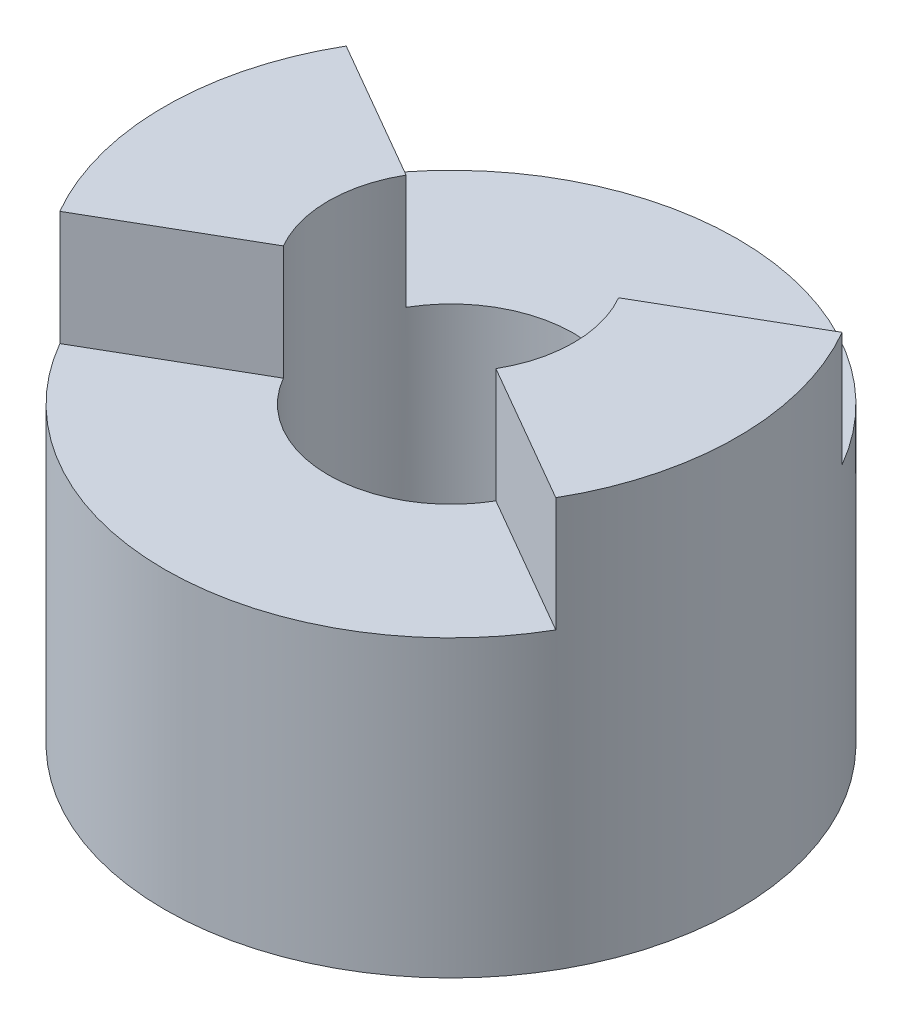
ISO-10303-21;
HEADER;
FILE_DESCRIPTION(('STEP AP214'),'2;1');
FILE_NAME('part.step','',(''),(''),'','','');
FILE_SCHEMA(('AUTOMOTIVE_DESIGN { 1 0 10303 214 1 1 1 1 }'));
ENDSEC;
DATA;
#1=APPLICATION_CONTEXT('core data for automotive mechanical design processes');
#2=APPLICATION_PROTOCOL_DEFINITION('international standard','automotive_design',2000,#1);
#3=PRODUCT_CONTEXT('',#1,'mechanical');
#4=PRODUCT('Part','Part','',(#3));
#5=PRODUCT_RELATED_PRODUCT_CATEGORY('part','',(#4));
#6=PRODUCT_DEFINITION_FORMATION('','',#4);
#7=PRODUCT_DEFINITION_CONTEXT('part definition',#1,'design');
#8=PRODUCT_DEFINITION('design','',#6,#7);
#9=PRODUCT_DEFINITION_SHAPE('','',#8);
#10=(LENGTH_UNIT() NAMED_UNIT(*) SI_UNIT(.MILLI.,.METRE.));
#11=(NAMED_UNIT(*) PLANE_ANGLE_UNIT() SI_UNIT($,.RADIAN.));
#12=(NAMED_UNIT(*) SI_UNIT($,.STERADIAN.) SOLID_ANGLE_UNIT());
#13=UNCERTAINTY_MEASURE_WITH_UNIT(LENGTH_MEASURE(1.E-05),#10,'distance_accuracy_value','');
#14=(GEOMETRIC_REPRESENTATION_CONTEXT(3) GLOBAL_UNCERTAINTY_ASSIGNED_CONTEXT((#13)) GLOBAL_UNIT_ASSIGNED_CONTEXT((#10,
#11,#12)) REPRESENTATION_CONTEXT('',''));
#15=CARTESIAN_POINT('',(0.,0.,0.));
#16=DIRECTION('',(0.,0.,1.));
#17=DIRECTION('',(1.,0.,0.));
#18=AXIS2_PLACEMENT_3D('',#15,#16,#17);
#19=CARTESIAN_POINT('',(0.,50.,0.));
#20=DIRECTION('',(0.,1.,0.));
#21=DIRECTION('',(0.,0.,1.));
#22=AXIS2_PLACEMENT_3D('',#19,#20,#21);
#23=PLANE('',#22);
#24=CARTESIAN_POINT('',(0.,50.,0.));
#25=DIRECTION('',(0.,1.,0.));
#26=DIRECTION('',(0.,0.,1.));
#27=AXIS2_PLACEMENT_3D('',#24,#25,#26);
#28=CIRCLE('',#27,15.);
#29=CARTESIAN_POINT('',(-12.9903810567666,50.,-7.49999999999997));
#30=VERTEX_POINT('',#29);
#31=CARTESIAN_POINT('',(-12.9903810567666,50.,7.49999999999997));
#32=VERTEX_POINT('',#31);
#33=EDGE_CURVE('E117',#30,#32,#28,.T.);
#34=ORIENTED_EDGE('',*,*,#33,.F.);
#35=DIRECTION('',(-0.86602540378444,0.,-0.499999999999998));
#36=VECTOR('',#35,1.);
#37=CARTESIAN_POINT('',(-12.9903810567666,50.,-7.49999999999997));
#38=LINE('',#37,#36);
#39=CARTESIAN_POINT('',(-30.3108891324554,50.,-17.4999999999999));
#40=VERTEX_POINT('',#39);
#41=EDGE_CURVE('E105',#30,#40,#38,.T.);
#42=ORIENTED_EDGE('',*,*,#41,.T.);
#43=CARTESIAN_POINT('',(0.,50.,0.));
#44=DIRECTION('',(0.,1.,0.));
#45=DIRECTION('',(0.,0.,1.));
#46=AXIS2_PLACEMENT_3D('',#43,#44,#45);
#47=CIRCLE('',#46,35.);
#48=CARTESIAN_POINT('',(-30.3108891324554,50.,17.4999999999999));
#49=VERTEX_POINT('',#48);
#50=EDGE_CURVE('E44',#40,#49,#47,.T.);
#51=ORIENTED_EDGE('',*,*,#50,.T.);
#52=DIRECTION('',(-0.86602540378444,0.,0.499999999999998));
#53=VECTOR('',#52,1.);
#54=CARTESIAN_POINT('',(-12.9903810567666,50.,7.49999999999997));
#55=LINE('',#54,#53);
#56=EDGE_CURVE('E136',#32,#49,#55,.T.);
#57=ORIENTED_EDGE('',*,*,#56,.F.);
#58=EDGE_LOOP('',(#34,#42,#51,#57));
#59=FACE_BOUND('',#58,.T.);
#60=ADVANCED_FACE('F35',(#59),#23,.T.);
#61=CARTESIAN_POINT('',(30.3108891324554,50.,17.4999999999999));
#62=VERTEX_POINT('',#61);
#63=CARTESIAN_POINT('',(30.3108891324554,50.,-17.4999999999999));
#64=VERTEX_POINT('',#63);
#65=EDGE_CURVE('E12',#62,#64,#47,.T.);
#66=ORIENTED_EDGE('',*,*,#65,.T.);
#67=DIRECTION('',(-0.86602540378444,0.,0.499999999999998));
#68=VECTOR('',#67,1.);
#69=CARTESIAN_POINT('',(12.9903810567666,50.,-7.49999999999997));
#70=LINE('',#69,#68);
#71=CARTESIAN_POINT('',(12.9903810567666,50.,-7.49999999999997));
#72=VERTEX_POINT('',#71);
#73=EDGE_CURVE('E111',#64,#72,#70,.T.);
#74=ORIENTED_EDGE('',*,*,#73,.T.);
#75=CARTESIAN_POINT('',(12.9903810567666,50.,7.49999999999997));
#76=VERTEX_POINT('',#75);
#77=EDGE_CURVE('E124',#76,#72,#28,.T.);
#78=ORIENTED_EDGE('',*,*,#77,.F.);
#79=DIRECTION('',(-0.86602540378444,0.,-0.499999999999998));
#80=VECTOR('',#79,1.);
#81=CARTESIAN_POINT('',(12.9903810567666,50.,7.49999999999997));
#82=LINE('',#81,#80);
#83=EDGE_CURVE('E145',#62,#76,#82,.T.);
#84=ORIENTED_EDGE('',*,*,#83,.F.);
#85=EDGE_LOOP('',(#66,#74,#78,#84));
#86=FACE_BOUND('',#85,.T.);
#87=ADVANCED_FACE('F176',(#86),#23,.T.);
#88=CARTESIAN_POINT('',(0.,50.,0.));
#89=DIRECTION('',(0.,-1.,0.));
#90=DIRECTION('',(0.,0.,-1.));
#91=AXIS2_PLACEMENT_3D('',#88,#89,#90);
#92=CYLINDRICAL_SURFACE('',#91,35.);
#93=CARTESIAN_POINT('',(0.,0.,0.));
#94=DIRECTION('',(0.,1.,0.));
#95=DIRECTION('',(0.,0.,1.));
#96=AXIS2_PLACEMENT_3D('',#93,#94,#95);
#97=CIRCLE('',#96,35.);
#98=CARTESIAN_POINT('',(0.,0.,35.));
#99=VERTEX_POINT('',#98);
#100=EDGE_CURVE('E39',#99,#99,#97,.T.);
#101=ORIENTED_EDGE('',*,*,#100,.T.);
#102=EDGE_LOOP('',(#101));
#103=FACE_BOUND('',#102,.T.);
#104=DIRECTION('',(0.,1.,0.));
#105=VECTOR('',#104,1.);
#106=CARTESIAN_POINT('',(-30.3108891324554,-66.5676347784718,-17.4999999999999));
#107=LINE('',#106,#105);
#108=CARTESIAN_POINT('',(-30.3108891324554,36.,-17.4999999999999));
#109=VERTEX_POINT('',#108);
#110=EDGE_CURVE('E102',#109,#40,#107,.T.);
#111=ORIENTED_EDGE('',*,*,#110,.F.);
#112=CARTESIAN_POINT('',(0.,36.,0.));
#113=DIRECTION('',(0.,1.,0.));
#114=DIRECTION('',(0.,0.,1.));
#115=AXIS2_PLACEMENT_3D('',#112,#113,#114);
#116=CIRCLE('',#115,35.);
#117=CARTESIAN_POINT('',(30.3108891324554,36.,-17.4999999999999));
#118=VERTEX_POINT('',#117);
#119=EDGE_CURVE('E147',#118,#109,#116,.T.);
#120=ORIENTED_EDGE('',*,*,#119,.F.);
#121=DIRECTION('',(0.,1.,0.));
#122=VECTOR('',#121,1.);
#123=CARTESIAN_POINT('',(30.3108891324554,-66.5676347784718,-17.4999999999999));
#124=LINE('',#123,#122);
#125=EDGE_CURVE('E154',#118,#64,#124,.T.);
#126=ORIENTED_EDGE('',*,*,#125,.T.);
#127=ORIENTED_EDGE('',*,*,#65,.F.);
#128=DIRECTION('',(0.,1.,0.));
#129=VECTOR('',#128,1.);
#130=CARTESIAN_POINT('',(30.3108891324554,-66.5676347784718,17.4999999999999));
#131=LINE('',#130,#129);
#132=CARTESIAN_POINT('',(30.3108891324554,36.,17.4999999999999));
#133=VERTEX_POINT('',#132);
#134=EDGE_CURVE('E133',#133,#62,#131,.T.);
#135=ORIENTED_EDGE('',*,*,#134,.F.);
#136=CARTESIAN_POINT('',(0.,36.,0.));
#137=DIRECTION('',(0.,1.,0.));
#138=DIRECTION('',(0.,0.,1.));
#139=AXIS2_PLACEMENT_3D('',#136,#137,#138);
#140=CIRCLE('',#139,35.);
#141=CARTESIAN_POINT('',(-30.3108891324554,36.,17.4999999999999));
#142=VERTEX_POINT('',#141);
#143=EDGE_CURVE('E132',#133,#142,#140,.F.);
#144=ORIENTED_EDGE('',*,*,#143,.T.);
#145=DIRECTION('',(0.,1.,0.));
#146=VECTOR('',#145,1.);
#147=CARTESIAN_POINT('',(-30.3108891324554,-66.5676347784718,17.4999999999999));
#148=LINE('',#147,#146);
#149=EDGE_CURVE('E122',#142,#49,#148,.T.);
#150=ORIENTED_EDGE('',*,*,#149,.T.);
#151=ORIENTED_EDGE('',*,*,#50,.F.);
#152=EDGE_LOOP('',(#111,#120,#126,#127,#135,#144,#150,#151));
#153=FACE_BOUND('',#152,.T.);
#154=ADVANCED_FACE('F37',(#103,#153),#92,.T.);
#155=CARTESIAN_POINT('',(0.,50.,0.));
#156=DIRECTION('',(0.,-1.,0.));
#157=DIRECTION('',(0.,0.,-1.));
#158=AXIS2_PLACEMENT_3D('',#155,#156,#157);
#159=CYLINDRICAL_SURFACE('',#158,15.);
#160=CARTESIAN_POINT('',(0.,0.,0.));
#161=DIRECTION('',(0.,1.,0.));
#162=DIRECTION('',(0.,0.,1.));
#163=AXIS2_PLACEMENT_3D('',#160,#161,#162);
#164=CIRCLE('',#163,15.);
#165=CARTESIAN_POINT('',(0.,0.,15.));
#166=VERTEX_POINT('',#165);
#167=EDGE_CURVE('E126',#166,#166,#164,.T.);
#168=ORIENTED_EDGE('',*,*,#167,.F.);
#169=EDGE_LOOP('',(#168));
#170=FACE_BOUND('',#169,.T.);
#171=CARTESIAN_POINT('',(0.,36.,0.));
#172=DIRECTION('',(0.,1.,0.));
#173=DIRECTION('',(0.,0.,1.));
#174=AXIS2_PLACEMENT_3D('',#171,#172,#173);
#175=CIRCLE('',#174,15.);
#176=CARTESIAN_POINT('',(-12.9903810567666,36.,-7.49999999999997));
#177=VERTEX_POINT('',#176);
#178=CARTESIAN_POINT('',(12.9903810567666,36.,-7.49999999999997));
#179=VERTEX_POINT('',#178);
#180=EDGE_CURVE('E153',#177,#179,#175,.F.);
#181=ORIENTED_EDGE('',*,*,#180,.F.);
#182=DIRECTION('',(0.,1.,0.));
#183=VECTOR('',#182,1.);
#184=CARTESIAN_POINT('',(-12.9903810567666,-66.5676347784718,-7.49999999999997));
#185=LINE('',#184,#183);
#186=EDGE_CURVE('E110',#177,#30,#185,.T.);
#187=ORIENTED_EDGE('',*,*,#186,.T.);
#188=ORIENTED_EDGE('',*,*,#33,.T.);
#189=DIRECTION('',(0.,1.,0.));
#190=VECTOR('',#189,1.);
#191=CARTESIAN_POINT('',(-12.9903810567666,-66.5676347784718,7.49999999999997));
#192=LINE('',#191,#190);
#193=CARTESIAN_POINT('',(-12.9903810567666,36.,7.49999999999997));
#194=VERTEX_POINT('',#193);
#195=EDGE_CURVE('E139',#194,#32,#192,.T.);
#196=ORIENTED_EDGE('',*,*,#195,.F.);
#197=CARTESIAN_POINT('',(0.,36.,0.));
#198=DIRECTION('',(0.,1.,0.));
#199=DIRECTION('',(0.,0.,1.));
#200=AXIS2_PLACEMENT_3D('',#197,#198,#199);
#201=CIRCLE('',#200,15.);
#202=CARTESIAN_POINT('',(12.9903810567666,36.,7.49999999999997));
#203=VERTEX_POINT('',#202);
#204=EDGE_CURVE('E143',#194,#203,#201,.T.);
#205=ORIENTED_EDGE('',*,*,#204,.T.);
#206=DIRECTION('',(0.,1.,0.));
#207=VECTOR('',#206,1.);
#208=CARTESIAN_POINT('',(12.9903810567666,-66.5676347784718,7.49999999999997));
#209=LINE('',#208,#207);
#210=EDGE_CURVE('E135',#203,#76,#209,.T.);
#211=ORIENTED_EDGE('',*,*,#210,.T.);
#212=ORIENTED_EDGE('',*,*,#77,.T.);
#213=DIRECTION('',(0.,1.,0.));
#214=VECTOR('',#213,1.);
#215=CARTESIAN_POINT('',(12.9903810567666,-66.5676347784718,-7.49999999999997));
#216=LINE('',#215,#214);
#217=EDGE_CURVE('E157',#179,#72,#216,.T.);
#218=ORIENTED_EDGE('',*,*,#217,.F.);
#219=EDGE_LOOP('',(#181,#187,#188,#196,#205,#211,#212,#218));
#220=FACE_BOUND('',#219,.T.);
#221=ADVANCED_FACE('F171',(#170,#220),#159,.F.);
#222=CARTESIAN_POINT('',(0.,0.,0.));
#223=DIRECTION('',(0.,1.,0.));
#224=DIRECTION('',(0.,0.,1.));
#225=AXIS2_PLACEMENT_3D('',#222,#223,#224);
#226=PLANE('',#225);
#227=ORIENTED_EDGE('',*,*,#100,.F.);
#228=EDGE_LOOP('',(#227));
#229=FACE_BOUND('',#228,.T.);
#230=ORIENTED_EDGE('',*,*,#167,.T.);
#231=EDGE_LOOP('',(#230));
#232=FACE_BOUND('',#231,.T.);
#233=ADVANCED_FACE('F187',(#229,#232),#226,.F.);
#234=CARTESIAN_POINT('',(-12.9903810567666,-66.5676347784718,7.49999999999997));
#235=DIRECTION('',(-0.499999999999998,0.,-0.86602540378444));
#236=DIRECTION('',(-0.86602540378444,0.,0.499999999999998));
#237=AXIS2_PLACEMENT_3D('',#234,#235,#236);
#238=PLANE('',#237);
#239=DIRECTION('',(0.86602540378444,0.,-0.499999999999998));
#240=VECTOR('',#239,1.);
#241=CARTESIAN_POINT('',(-12.9903810567666,36.,7.49999999999997));
#242=LINE('',#241,#240);
#243=EDGE_CURVE('E149',#142,#194,#242,.T.);
#244=ORIENTED_EDGE('',*,*,#243,.T.);
#245=ORIENTED_EDGE('',*,*,#195,.T.);
#246=ORIENTED_EDGE('',*,*,#56,.T.);
#247=ORIENTED_EDGE('',*,*,#149,.F.);
#248=EDGE_LOOP('',(#244,#245,#246,#247));
#249=FACE_BOUND('',#248,.T.);
#250=ADVANCED_FACE('F185',(#249),#238,.F.);
#251=CARTESIAN_POINT('',(12.9903810567666,-66.5676347784718,7.49999999999997));
#252=DIRECTION('',(0.499999999999998,0.,-0.86602540378444));
#253=DIRECTION('',(-0.86602540378444,0.,-0.499999999999998));
#254=AXIS2_PLACEMENT_3D('',#251,#252,#253);
#255=PLANE('',#254);
#256=DIRECTION('',(0.86602540378444,0.,0.499999999999998));
#257=VECTOR('',#256,1.);
#258=CARTESIAN_POINT('',(12.9903810567666,36.,7.49999999999997));
#259=LINE('',#258,#257);
#260=EDGE_CURVE('E59',#203,#133,#259,.T.);
#261=ORIENTED_EDGE('',*,*,#260,.T.);
#262=ORIENTED_EDGE('',*,*,#134,.T.);
#263=ORIENTED_EDGE('',*,*,#83,.T.);
#264=ORIENTED_EDGE('',*,*,#210,.F.);
#265=EDGE_LOOP('',(#261,#262,#263,#264));
#266=FACE_BOUND('',#265,.T.);
#267=ADVANCED_FACE('F181',(#266),#255,.F.);
#268=CARTESIAN_POINT('',(0.,36.,0.));
#269=DIRECTION('',(0.,1.,0.));
#270=DIRECTION('',(0.,0.,1.));
#271=AXIS2_PLACEMENT_3D('',#268,#269,#270);
#272=PLANE('',#271);
#273=ORIENTED_EDGE('',*,*,#143,.F.);
#274=ORIENTED_EDGE('',*,*,#260,.F.);
#275=ORIENTED_EDGE('',*,*,#204,.F.);
#276=ORIENTED_EDGE('',*,*,#243,.F.);
#277=EDGE_LOOP('',(#273,#274,#275,#276));
#278=FACE_BOUND('',#277,.T.);
#279=ADVANCED_FACE('F182',(#278),#272,.T.);
#280=CARTESIAN_POINT('',(-12.9903810567666,-66.5676347784718,-7.49999999999997));
#281=DIRECTION('',(0.499999999999998,0.,-0.86602540378444));
#282=DIRECTION('',(-0.86602540378444,0.,-0.499999999999998));
#283=AXIS2_PLACEMENT_3D('',#280,#281,#282);
#284=PLANE('',#283);
#285=ORIENTED_EDGE('',*,*,#110,.T.);
#286=ORIENTED_EDGE('',*,*,#41,.F.);
#287=ORIENTED_EDGE('',*,*,#186,.F.);
#288=DIRECTION('',(0.86602540378444,0.,0.499999999999998));
#289=VECTOR('',#288,1.);
#290=CARTESIAN_POINT('',(-12.9903810567666,36.,-7.49999999999997));
#291=LINE('',#290,#289);
#292=EDGE_CURVE('E51',#109,#177,#291,.T.);
#293=ORIENTED_EDGE('',*,*,#292,.F.);
#294=EDGE_LOOP('',(#285,#286,#287,#293));
#295=FACE_BOUND('',#294,.T.);
#296=ADVANCED_FACE('F104',(#295),#284,.T.);
#297=CARTESIAN_POINT('',(12.9903810567666,-66.5676347784718,-7.49999999999997));
#298=DIRECTION('',(-0.499999999999998,0.,-0.86602540378444));
#299=DIRECTION('',(-0.86602540378444,0.,0.499999999999998));
#300=AXIS2_PLACEMENT_3D('',#297,#298,#299);
#301=PLANE('',#300);
#302=ORIENTED_EDGE('',*,*,#217,.T.);
#303=ORIENTED_EDGE('',*,*,#73,.F.);
#304=ORIENTED_EDGE('',*,*,#125,.F.);
#305=DIRECTION('',(0.86602540378444,0.,-0.499999999999998));
#306=VECTOR('',#305,1.);
#307=CARTESIAN_POINT('',(12.9903810567666,36.,-7.49999999999997));
#308=LINE('',#307,#306);
#309=EDGE_CURVE('E164',#179,#118,#308,.T.);
#310=ORIENTED_EDGE('',*,*,#309,.F.);
#311=EDGE_LOOP('',(#302,#303,#304,#310));
#312=FACE_BOUND('',#311,.T.);
#313=ADVANCED_FACE('F174',(#312),#301,.T.);
#314=CARTESIAN_POINT('',(0.,36.,0.));
#315=DIRECTION('',(0.,1.,0.));
#316=DIRECTION('',(0.,0.,1.));
#317=AXIS2_PLACEMENT_3D('',#314,#315,#316);
#318=PLANE('',#317);
#319=ORIENTED_EDGE('',*,*,#309,.T.);
#320=ORIENTED_EDGE('',*,*,#119,.T.);
#321=ORIENTED_EDGE('',*,*,#292,.T.);
#322=ORIENTED_EDGE('',*,*,#180,.T.);
#323=EDGE_LOOP('',(#319,#320,#321,#322));
#324=FACE_BOUND('',#323,.T.);
#325=ADVANCED_FACE('F169',(#324),#318,.T.);
#326=CLOSED_SHELL('',(#60,#87,#154,#221,#233,#250,#267,#279,#296,#313,#325));
#327=MANIFOLD_SOLID_BREP('B2',#326);
#328=ADVANCED_BREP_SHAPE_REPRESENTATION('',(#18,#327),#14);
#329=SHAPE_DEFINITION_REPRESENTATION(#9,#328);
ENDSEC;
END-ISO-10303-21;
